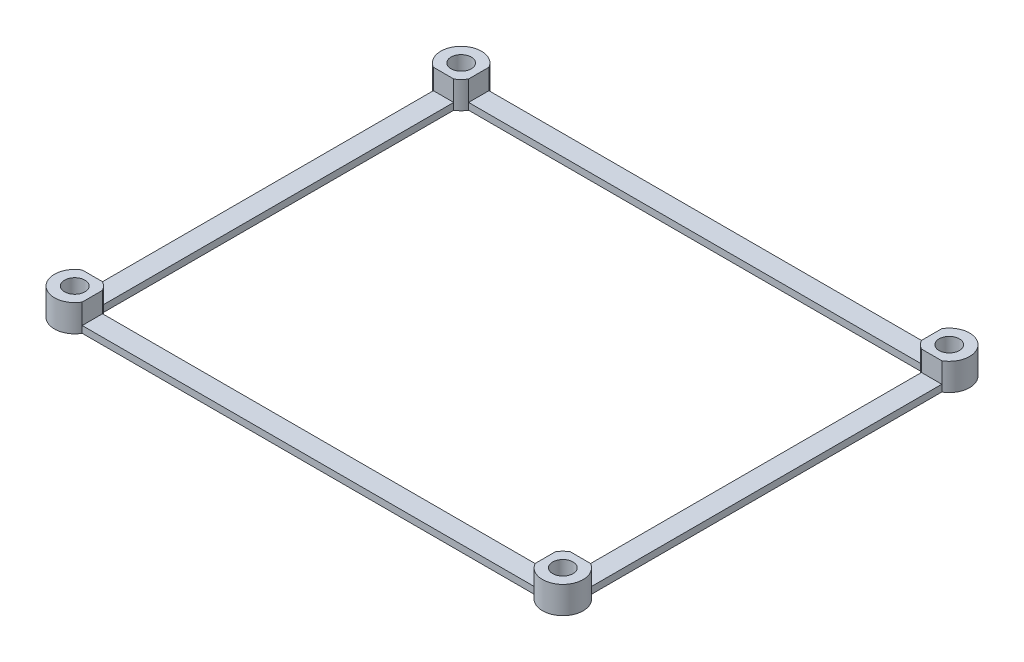
ISO-10303-21;
HEADER;
FILE_DESCRIPTION(('STEP AP214'),'2;1');
FILE_NAME('part.step','',(''),(''),'','','');
FILE_SCHEMA(('AUTOMOTIVE_DESIGN { 1 0 10303 214 1 1 1 1 }'));
ENDSEC;
DATA;
#1=APPLICATION_CONTEXT('core data for automotive mechanical design processes');
#2=APPLICATION_PROTOCOL_DEFINITION('international standard','automotive_design',2000,#1);
#3=PRODUCT_CONTEXT('',#1,'mechanical');
#4=PRODUCT('Part','Part','',(#3));
#5=PRODUCT_RELATED_PRODUCT_CATEGORY('part','',(#4));
#6=PRODUCT_DEFINITION_FORMATION('','',#4);
#7=PRODUCT_DEFINITION_CONTEXT('part definition',#1,'design');
#8=PRODUCT_DEFINITION('design','',#6,#7);
#9=PRODUCT_DEFINITION_SHAPE('','',#8);
#10=(LENGTH_UNIT() NAMED_UNIT(*) SI_UNIT(.MILLI.,.METRE.));
#11=(NAMED_UNIT(*) PLANE_ANGLE_UNIT() SI_UNIT($,.RADIAN.));
#12=(NAMED_UNIT(*) SI_UNIT($,.STERADIAN.) SOLID_ANGLE_UNIT());
#13=UNCERTAINTY_MEASURE_WITH_UNIT(LENGTH_MEASURE(1.E-05),#10,'distance_accuracy_value','');
#14=(GEOMETRIC_REPRESENTATION_CONTEXT(3) GLOBAL_UNCERTAINTY_ASSIGNED_CONTEXT((#13)) GLOBAL_UNIT_ASSIGNED_CONTEXT((#10,
#11,#12)) REPRESENTATION_CONTEXT('',''));
#15=CARTESIAN_POINT('',(0.,0.,0.));
#16=DIRECTION('',(0.,0.,1.));
#17=DIRECTION('',(1.,0.,0.));
#18=AXIS2_PLACEMENT_3D('',#15,#16,#17);
#19=CARTESIAN_POINT('',(36.,4.,-28.5));
#20=DIRECTION('',(0.,1.,0.));
#21=DIRECTION('',(0.,0.,1.));
#22=AXIS2_PLACEMENT_3D('',#19,#20,#21);
#23=PLANE('',#22);
#24=DIRECTION('',(-1.,0.,0.));
#25=VECTOR('',#24,1.);
#26=CARTESIAN_POINT('',(-37.5,4.,-25.9019237886467));
#27=LINE('',#26,#25);
#28=CARTESIAN_POINT('',(-34.5,4.,-25.9019237886467));
#29=VERTEX_POINT('',#28);
#30=CARTESIAN_POINT('',(-37.5,4.,-25.9019237886467));
#31=VERTEX_POINT('',#30);
#32=EDGE_CURVE('E226',#29,#31,#27,.T.);
#33=ORIENTED_EDGE('',*,*,#32,.F.);
#34=CARTESIAN_POINT('',(-36.,4.,-28.5));
#35=DIRECTION('',(0.,-1.,0.));
#36=DIRECTION('',(0.,0.,1.));
#37=AXIS2_PLACEMENT_3D('',#34,#35,#36);
#38=CIRCLE('',#37,3.);
#39=CARTESIAN_POINT('',(-33.4019237886467,4.,-27.));
#40=VERTEX_POINT('',#39);
#41=EDGE_CURVE('E325',#40,#29,#38,.T.);
#42=ORIENTED_EDGE('',*,*,#41,.F.);
#43=DIRECTION('',(0.,0.,1.));
#44=VECTOR('',#43,1.);
#45=CARTESIAN_POINT('',(-33.4019237886467,4.,-27.));
#46=LINE('',#45,#44);
#47=CARTESIAN_POINT('',(-33.4019237886467,4.,-30.));
#48=VERTEX_POINT('',#47);
#49=EDGE_CURVE('E324',#48,#40,#46,.T.);
#50=ORIENTED_EDGE('',*,*,#49,.F.);
#51=CARTESIAN_POINT('',(-36.,4.,-28.5));
#52=DIRECTION('',(0.,1.,0.));
#53=DIRECTION('',(0.,0.,1.));
#54=AXIS2_PLACEMENT_3D('',#51,#52,#53);
#55=CIRCLE('',#54,3.);
#56=EDGE_CURVE('E235',#48,#31,#55,.T.);
#57=ORIENTED_EDGE('',*,*,#56,.T.);
#58=EDGE_LOOP('',(#33,#42,#50,#57));
#59=FACE_BOUND('',#58,.T.);
#60=CARTESIAN_POINT('',(-36.,4.,-28.5));
#61=DIRECTION('',(0.,1.,0.));
#62=DIRECTION('',(0.,0.,1.));
#63=AXIS2_PLACEMENT_3D('',#60,#61,#62);
#64=CIRCLE('',#63,1.5);
#65=CARTESIAN_POINT('',(-36.,4.,-27.));
#66=VERTEX_POINT('',#65);
#67=EDGE_CURVE('E397',#66,#66,#64,.T.);
#68=ORIENTED_EDGE('',*,*,#67,.F.);
#69=EDGE_LOOP('',(#68));
#70=FACE_BOUND('',#69,.T.);
#71=ADVANCED_FACE('F41',(#59,#70),#23,.T.);
#72=DIRECTION('',(1.,0.,0.));
#73=VECTOR('',#72,1.);
#74=CARTESIAN_POINT('',(-37.5,4.,25.9019237886467));
#75=LINE('',#74,#73);
#76=CARTESIAN_POINT('',(-37.5,4.,25.9019237886467));
#77=VERTEX_POINT('',#76);
#78=CARTESIAN_POINT('',(-34.5,4.,25.9019237886467));
#79=VERTEX_POINT('',#78);
#80=EDGE_CURVE('E206',#77,#79,#75,.T.);
#81=ORIENTED_EDGE('',*,*,#80,.F.);
#82=CARTESIAN_POINT('',(-36.,4.,28.5));
#83=DIRECTION('',(0.,1.,0.));
#84=DIRECTION('',(0.,0.,1.));
#85=AXIS2_PLACEMENT_3D('',#82,#83,#84);
#86=CIRCLE('',#85,3.00000000000001);
#87=CARTESIAN_POINT('',(-33.4019237886467,4.,30.));
#88=VERTEX_POINT('',#87);
#89=EDGE_CURVE('E222',#77,#88,#86,.T.);
#90=ORIENTED_EDGE('',*,*,#89,.T.);
#91=DIRECTION('',(0.,0.,1.));
#92=VECTOR('',#91,1.);
#93=CARTESIAN_POINT('',(-33.4019237886467,4.,27.));
#94=LINE('',#93,#92);
#95=CARTESIAN_POINT('',(-33.4019237886467,4.,27.));
#96=VERTEX_POINT('',#95);
#97=EDGE_CURVE('E440',#96,#88,#94,.T.);
#98=ORIENTED_EDGE('',*,*,#97,.F.);
#99=CARTESIAN_POINT('',(-36.,4.,28.5));
#100=DIRECTION('',(0.,-1.,0.));
#101=DIRECTION('',(0.,0.,1.));
#102=AXIS2_PLACEMENT_3D('',#99,#100,#101);
#103=CIRCLE('',#102,3.00000000000001);
#104=EDGE_CURVE('E225',#79,#96,#103,.T.);
#105=ORIENTED_EDGE('',*,*,#104,.F.);
#106=EDGE_LOOP('',(#81,#90,#98,#105));
#107=FACE_BOUND('',#106,.T.);
#108=CARTESIAN_POINT('',(-36.,4.,28.5));
#109=DIRECTION('',(0.,1.,0.));
#110=DIRECTION('',(0.,0.,1.));
#111=AXIS2_PLACEMENT_3D('',#108,#109,#110);
#112=CIRCLE('',#111,1.5);
#113=CARTESIAN_POINT('',(-36.,4.,30.));
#114=VERTEX_POINT('',#113);
#115=EDGE_CURVE('E403',#114,#114,#112,.T.);
#116=ORIENTED_EDGE('',*,*,#115,.F.);
#117=EDGE_LOOP('',(#116));
#118=FACE_BOUND('',#117,.T.);
#119=ADVANCED_FACE('F219',(#107,#118),#23,.T.);
#120=DIRECTION('',(-1.,0.,0.));
#121=VECTOR('',#120,1.);
#122=CARTESIAN_POINT('',(34.5,4.,-25.9019237886467));
#123=LINE('',#122,#121);
#124=CARTESIAN_POINT('',(37.5,4.,-25.9019237886467));
#125=VERTEX_POINT('',#124);
#126=CARTESIAN_POINT('',(34.5,4.,-25.9019237886467));
#127=VERTEX_POINT('',#126);
#128=EDGE_CURVE('E427',#125,#127,#123,.T.);
#129=ORIENTED_EDGE('',*,*,#128,.F.);
#130=CARTESIAN_POINT('',(36.,4.,-28.5));
#131=DIRECTION('',(0.,1.,0.));
#132=DIRECTION('',(0.,0.,1.));
#133=AXIS2_PLACEMENT_3D('',#130,#131,#132);
#134=CIRCLE('',#133,3.);
#135=CARTESIAN_POINT('',(33.4019237886467,4.,-30.));
#136=VERTEX_POINT('',#135);
#137=EDGE_CURVE('E241',#125,#136,#134,.T.);
#138=ORIENTED_EDGE('',*,*,#137,.T.);
#139=DIRECTION('',(0.,0.,-1.));
#140=VECTOR('',#139,1.);
#141=CARTESIAN_POINT('',(33.4019237886467,4.,-27.));
#142=LINE('',#141,#140);
#143=CARTESIAN_POINT('',(33.4019237886467,4.,-27.));
#144=VERTEX_POINT('',#143);
#145=EDGE_CURVE('E327',#144,#136,#142,.T.);
#146=ORIENTED_EDGE('',*,*,#145,.F.);
#147=CARTESIAN_POINT('',(36.,4.,-28.5));
#148=DIRECTION('',(0.,-1.,0.));
#149=DIRECTION('',(0.,0.,1.));
#150=AXIS2_PLACEMENT_3D('',#147,#148,#149);
#151=CIRCLE('',#150,3.);
#152=EDGE_CURVE('E344',#127,#144,#151,.T.);
#153=ORIENTED_EDGE('',*,*,#152,.F.);
#154=EDGE_LOOP('',(#129,#138,#146,#153));
#155=FACE_BOUND('',#154,.T.);
#156=CARTESIAN_POINT('',(36.,4.,-28.5));
#157=DIRECTION('',(0.,1.,0.));
#158=DIRECTION('',(0.,0.,1.));
#159=AXIS2_PLACEMENT_3D('',#156,#157,#158);
#160=CIRCLE('',#159,1.5);
#161=CARTESIAN_POINT('',(36.,4.,-27.));
#162=VERTEX_POINT('',#161);
#163=EDGE_CURVE('E249',#162,#162,#160,.T.);
#164=ORIENTED_EDGE('',*,*,#163,.F.);
#165=EDGE_LOOP('',(#164));
#166=FACE_BOUND('',#165,.T.);
#167=ADVANCED_FACE('F424',(#155,#166),#23,.T.);
#168=CARTESIAN_POINT('',(-33.4019237886467,4.,-30.));
#169=DIRECTION('',(0.,0.,1.));
#170=DIRECTION('',(1.,0.,0.));
#171=AXIS2_PLACEMENT_3D('',#168,#169,#170);
#172=PLANE('',#171);
#173=DIRECTION('',(1.,0.,0.));
#174=VECTOR('',#173,1.);
#175=CARTESIAN_POINT('',(33.4019237886467,1.,-30.));
#176=LINE('',#175,#174);
#177=CARTESIAN_POINT('',(-33.4019237886467,1.,-30.));
#178=VERTEX_POINT('',#177);
#179=CARTESIAN_POINT('',(33.4019237886467,1.,-30.));
#180=VERTEX_POINT('',#179);
#181=EDGE_CURVE('E334',#178,#180,#176,.T.);
#182=ORIENTED_EDGE('',*,*,#181,.T.);
#183=DIRECTION('',(0.,-1.,0.));
#184=VECTOR('',#183,1.);
#185=CARTESIAN_POINT('',(33.4019237886467,4.,-30.));
#186=LINE('',#185,#184);
#187=CARTESIAN_POINT('',(33.4019237886467,0.,-30.));
#188=VERTEX_POINT('',#187);
#189=EDGE_CURVE('E49',#180,#188,#186,.T.);
#190=ORIENTED_EDGE('',*,*,#189,.T.);
#191=DIRECTION('',(-1.,0.,0.));
#192=VECTOR('',#191,1.);
#193=CARTESIAN_POINT('',(-33.4019237886467,0.,-30.));
#194=LINE('',#193,#192);
#195=CARTESIAN_POINT('',(-33.4019237886467,0.,-30.));
#196=VERTEX_POINT('',#195);
#197=EDGE_CURVE('E248',#188,#196,#194,.T.);
#198=ORIENTED_EDGE('',*,*,#197,.T.);
#199=DIRECTION('',(0.,-1.,0.));
#200=VECTOR('',#199,1.);
#201=CARTESIAN_POINT('',(-33.4019237886467,4.,-30.));
#202=LINE('',#201,#200);
#203=EDGE_CURVE('E283',#178,#196,#202,.T.);
#204=ORIENTED_EDGE('',*,*,#203,.F.);
#205=EDGE_LOOP('',(#182,#190,#198,#204));
#206=FACE_BOUND('',#205,.T.);
#207=ADVANCED_FACE('F296',(#206),#172,.F.);
#208=CARTESIAN_POINT('',(-37.5,4.,25.9019237886467));
#209=DIRECTION('',(1.,0.,0.));
#210=DIRECTION('',(0.,0.,-1.));
#211=AXIS2_PLACEMENT_3D('',#208,#209,#210);
#212=PLANE('',#211);
#213=DIRECTION('',(0.,0.,-1.));
#214=VECTOR('',#213,1.);
#215=CARTESIAN_POINT('',(-37.5,1.,-25.9019237886467));
#216=LINE('',#215,#214);
#217=CARTESIAN_POINT('',(-37.5,1.,25.9019237886467));
#218=VERTEX_POINT('',#217);
#219=CARTESIAN_POINT('',(-37.5,1.,-25.9019237886467));
#220=VERTEX_POINT('',#219);
#221=EDGE_CURVE('E308',#218,#220,#216,.T.);
#222=ORIENTED_EDGE('',*,*,#221,.T.);
#223=DIRECTION('',(0.,-1.,0.));
#224=VECTOR('',#223,1.);
#225=CARTESIAN_POINT('',(-37.5,4.,-25.9019237886467));
#226=LINE('',#225,#224);
#227=CARTESIAN_POINT('',(-37.5,0.,-25.9019237886467));
#228=VERTEX_POINT('',#227);
#229=EDGE_CURVE('E213',#220,#228,#226,.T.);
#230=ORIENTED_EDGE('',*,*,#229,.T.);
#231=DIRECTION('',(0.,0.,1.));
#232=VECTOR('',#231,1.);
#233=CARTESIAN_POINT('',(-37.5,0.,25.9019237886467));
#234=LINE('',#233,#232);
#235=CARTESIAN_POINT('',(-37.5,0.,25.9019237886467));
#236=VERTEX_POINT('',#235);
#237=EDGE_CURVE('E255',#228,#236,#234,.T.);
#238=ORIENTED_EDGE('',*,*,#237,.T.);
#239=DIRECTION('',(0.,-1.,0.));
#240=VECTOR('',#239,1.);
#241=CARTESIAN_POINT('',(-37.5,4.,25.9019237886467));
#242=LINE('',#241,#240);
#243=EDGE_CURVE('E214',#218,#236,#242,.T.);
#244=ORIENTED_EDGE('',*,*,#243,.F.);
#245=EDGE_LOOP('',(#222,#230,#238,#244));
#246=FACE_BOUND('',#245,.T.);
#247=ADVANCED_FACE('F307',(#246),#212,.F.);
#248=CARTESIAN_POINT('',(-33.4019237886467,4.,30.));
#249=DIRECTION('',(0.,0.,-1.));
#250=DIRECTION('',(-1.,0.,0.));
#251=AXIS2_PLACEMENT_3D('',#248,#249,#250);
#252=PLANE('',#251);
#253=DIRECTION('',(-1.,0.,0.));
#254=VECTOR('',#253,1.);
#255=CARTESIAN_POINT('',(-33.4019237886467,1.,30.));
#256=LINE('',#255,#254);
#257=CARTESIAN_POINT('',(33.4019237886467,1.,30.));
#258=VERTEX_POINT('',#257);
#259=CARTESIAN_POINT('',(-33.4019237886467,1.,30.));
#260=VERTEX_POINT('',#259);
#261=EDGE_CURVE('E227',#258,#260,#256,.T.);
#262=ORIENTED_EDGE('',*,*,#261,.T.);
#263=DIRECTION('',(0.,-1.,0.));
#264=VECTOR('',#263,1.);
#265=CARTESIAN_POINT('',(-33.4019237886467,4.,30.));
#266=LINE('',#265,#264);
#267=CARTESIAN_POINT('',(-33.4019237886467,0.,30.));
#268=VERTEX_POINT('',#267);
#269=EDGE_CURVE('E279',#260,#268,#266,.T.);
#270=ORIENTED_EDGE('',*,*,#269,.T.);
#271=DIRECTION('',(1.,0.,0.));
#272=VECTOR('',#271,1.);
#273=CARTESIAN_POINT('',(-33.4019237886467,0.,30.));
#274=LINE('',#273,#272);
#275=CARTESIAN_POINT('',(33.4019237886467,0.,30.));
#276=VERTEX_POINT('',#275);
#277=EDGE_CURVE('E260',#268,#276,#274,.T.);
#278=ORIENTED_EDGE('',*,*,#277,.T.);
#279=DIRECTION('',(0.,-1.,0.));
#280=VECTOR('',#279,1.);
#281=CARTESIAN_POINT('',(33.4019237886467,4.,30.));
#282=LINE('',#281,#280);
#283=EDGE_CURVE('E275',#258,#276,#282,.T.);
#284=ORIENTED_EDGE('',*,*,#283,.F.);
#285=EDGE_LOOP('',(#262,#270,#278,#284));
#286=FACE_BOUND('',#285,.T.);
#287=ADVANCED_FACE('F522',(#286),#252,.F.);
#288=CARTESIAN_POINT('',(37.5,4.,25.9019237886467));
#289=DIRECTION('',(-1.,0.,0.));
#290=DIRECTION('',(0.,0.,1.));
#291=AXIS2_PLACEMENT_3D('',#288,#289,#290);
#292=PLANE('',#291);
#293=DIRECTION('',(0.,0.,1.));
#294=VECTOR('',#293,1.);
#295=CARTESIAN_POINT('',(37.5,1.,25.9019237886467));
#296=LINE('',#295,#294);
#297=CARTESIAN_POINT('',(37.5,1.,-25.9019237886467));
#298=VERTEX_POINT('',#297);
#299=CARTESIAN_POINT('',(37.5,1.,25.9019237886467));
#300=VERTEX_POINT('',#299);
#301=EDGE_CURVE('E443',#298,#300,#296,.T.);
#302=ORIENTED_EDGE('',*,*,#301,.T.);
#303=DIRECTION('',(0.,-1.,0.));
#304=VECTOR('',#303,1.);
#305=CARTESIAN_POINT('',(37.5,4.,25.9019237886467));
#306=LINE('',#305,#304);
#307=CARTESIAN_POINT('',(37.5,0.,25.9019237886467));
#308=VERTEX_POINT('',#307);
#309=EDGE_CURVE('E272',#300,#308,#306,.T.);
#310=ORIENTED_EDGE('',*,*,#309,.T.);
#311=DIRECTION('',(0.,0.,-1.));
#312=VECTOR('',#311,1.);
#313=CARTESIAN_POINT('',(37.5,0.,25.9019237886467));
#314=LINE('',#313,#312);
#315=CARTESIAN_POINT('',(37.5,0.,-25.9019237886467));
#316=VERTEX_POINT('',#315);
#317=EDGE_CURVE('E266',#308,#316,#314,.T.);
#318=ORIENTED_EDGE('',*,*,#317,.T.);
#319=DIRECTION('',(0.,-1.,0.));
#320=VECTOR('',#319,1.);
#321=CARTESIAN_POINT('',(37.5,4.,-25.9019237886467));
#322=LINE('',#321,#320);
#323=EDGE_CURVE('E238',#298,#316,#322,.T.);
#324=ORIENTED_EDGE('',*,*,#323,.F.);
#325=EDGE_LOOP('',(#302,#310,#318,#324));
#326=FACE_BOUND('',#325,.T.);
#327=ADVANCED_FACE('F532',(#326),#292,.F.);
#328=CARTESIAN_POINT('',(-34.5,4.,25.9019237886467));
#329=DIRECTION('',(1.,0.,0.));
#330=DIRECTION('',(0.,0.,-1.));
#331=AXIS2_PLACEMENT_3D('',#328,#329,#330);
#332=PLANE('',#331);
#333=DIRECTION('',(0.,-1.,0.));
#334=VECTOR('',#333,1.);
#335=CARTESIAN_POINT('',(-34.5,4.,-25.9019237886467));
#336=LINE('',#335,#334);
#337=CARTESIAN_POINT('',(-34.5,1.,-25.9019237886467));
#338=VERTEX_POINT('',#337);
#339=CARTESIAN_POINT('',(-34.5,0.,-25.9019237886467));
#340=VERTEX_POINT('',#339);
#341=EDGE_CURVE('E394',#338,#340,#336,.T.);
#342=ORIENTED_EDGE('',*,*,#341,.F.);
#343=DIRECTION('',(0.,0.,1.));
#344=VECTOR('',#343,1.);
#345=CARTESIAN_POINT('',(-34.5,1.,-25.9019237886467));
#346=LINE('',#345,#344);
#347=CARTESIAN_POINT('',(-34.5,1.,25.9019237886467));
#348=VERTEX_POINT('',#347);
#349=EDGE_CURVE('E320',#338,#348,#346,.T.);
#350=ORIENTED_EDGE('',*,*,#349,.T.);
#351=DIRECTION('',(0.,-1.,0.));
#352=VECTOR('',#351,1.);
#353=CARTESIAN_POINT('',(-34.5,4.,25.9019237886467));
#354=LINE('',#353,#352);
#355=CARTESIAN_POINT('',(-34.5,0.,25.9019237886467));
#356=VERTEX_POINT('',#355);
#357=EDGE_CURVE('E391',#348,#356,#354,.T.);
#358=ORIENTED_EDGE('',*,*,#357,.T.);
#359=DIRECTION('',(0.,0.,1.));
#360=VECTOR('',#359,1.);
#361=CARTESIAN_POINT('',(-34.5,0.,25.9019237886467));
#362=LINE('',#361,#360);
#363=EDGE_CURVE('E350',#340,#356,#362,.T.);
#364=ORIENTED_EDGE('',*,*,#363,.F.);
#365=EDGE_LOOP('',(#342,#350,#358,#364));
#366=FACE_BOUND('',#365,.T.);
#367=ADVANCED_FACE('F470',(#366),#332,.T.);
#368=CARTESIAN_POINT('',(-33.4019237886467,4.,27.));
#369=DIRECTION('',(0.,0.,-1.));
#370=DIRECTION('',(-1.,0.,0.));
#371=AXIS2_PLACEMENT_3D('',#368,#369,#370);
#372=PLANE('',#371);
#373=DIRECTION('',(0.,-1.,0.));
#374=VECTOR('',#373,1.);
#375=CARTESIAN_POINT('',(-33.4019237886467,4.,27.));
#376=LINE('',#375,#374);
#377=CARTESIAN_POINT('',(-33.4019237886467,1.,27.));
#378=VERTEX_POINT('',#377);
#379=CARTESIAN_POINT('',(-33.4019237886467,0.,27.));
#380=VERTEX_POINT('',#379);
#381=EDGE_CURVE('E387',#378,#380,#376,.T.);
#382=ORIENTED_EDGE('',*,*,#381,.F.);
#383=DIRECTION('',(1.,0.,0.));
#384=VECTOR('',#383,1.);
#385=CARTESIAN_POINT('',(-33.4019237886467,1.,27.));
#386=LINE('',#385,#384);
#387=CARTESIAN_POINT('',(33.4019237886467,1.,27.));
#388=VERTEX_POINT('',#387);
#389=EDGE_CURVE('E459',#378,#388,#386,.T.);
#390=ORIENTED_EDGE('',*,*,#389,.T.);
#391=DIRECTION('',(0.,-1.,0.));
#392=VECTOR('',#391,1.);
#393=CARTESIAN_POINT('',(33.4019237886467,4.,27.));
#394=LINE('',#393,#392);
#395=CARTESIAN_POINT('',(33.4019237886467,0.,27.));
#396=VERTEX_POINT('',#395);
#397=EDGE_CURVE('E383',#388,#396,#394,.T.);
#398=ORIENTED_EDGE('',*,*,#397,.T.);
#399=DIRECTION('',(1.,0.,0.));
#400=VECTOR('',#399,1.);
#401=CARTESIAN_POINT('',(-33.4019237886467,0.,27.));
#402=LINE('',#401,#400);
#403=EDGE_CURVE('E356',#380,#396,#402,.T.);
#404=ORIENTED_EDGE('',*,*,#403,.F.);
#405=EDGE_LOOP('',(#382,#390,#398,#404));
#406=FACE_BOUND('',#405,.T.);
#407=ADVANCED_FACE('F542',(#406),#372,.T.);
#408=CARTESIAN_POINT('',(34.5,4.,25.9019237886467));
#409=DIRECTION('',(-1.,0.,0.));
#410=DIRECTION('',(0.,0.,1.));
#411=AXIS2_PLACEMENT_3D('',#408,#409,#410);
#412=PLANE('',#411);
#413=DIRECTION('',(0.,-1.,0.));
#414=VECTOR('',#413,1.);
#415=CARTESIAN_POINT('',(34.5,4.,25.9019237886467));
#416=LINE('',#415,#414);
#417=CARTESIAN_POINT('',(34.5,1.,25.9019237886467));
#418=VERTEX_POINT('',#417);
#419=CARTESIAN_POINT('',(34.5,0.,25.9019237886467));
#420=VERTEX_POINT('',#419);
#421=EDGE_CURVE('E379',#418,#420,#416,.T.);
#422=ORIENTED_EDGE('',*,*,#421,.F.);
#423=DIRECTION('',(0.,0.,-1.));
#424=VECTOR('',#423,1.);
#425=CARTESIAN_POINT('',(34.5,1.,25.9019237886467));
#426=LINE('',#425,#424);
#427=CARTESIAN_POINT('',(34.5,1.,-25.9019237886467));
#428=VERTEX_POINT('',#427);
#429=EDGE_CURVE('E441',#418,#428,#426,.T.);
#430=ORIENTED_EDGE('',*,*,#429,.T.);
#431=DIRECTION('',(0.,-1.,0.));
#432=VECTOR('',#431,1.);
#433=CARTESIAN_POINT('',(34.5,4.,-25.9019237886467));
#434=LINE('',#433,#432);
#435=CARTESIAN_POINT('',(34.5,0.,-25.9019237886467));
#436=VERTEX_POINT('',#435);
#437=EDGE_CURVE('E375',#428,#436,#434,.T.);
#438=ORIENTED_EDGE('',*,*,#437,.T.);
#439=DIRECTION('',(0.,0.,-1.));
#440=VECTOR('',#439,1.);
#441=CARTESIAN_POINT('',(34.5,0.,25.9019237886467));
#442=LINE('',#441,#440);
#443=EDGE_CURVE('E362',#420,#436,#442,.T.);
#444=ORIENTED_EDGE('',*,*,#443,.F.);
#445=EDGE_LOOP('',(#422,#430,#438,#444));
#446=FACE_BOUND('',#445,.T.);
#447=ADVANCED_FACE('F511',(#446),#412,.T.);
#448=CARTESIAN_POINT('',(-33.4019237886467,4.,-27.));
#449=DIRECTION('',(0.,0.,1.));
#450=DIRECTION('',(1.,0.,0.));
#451=AXIS2_PLACEMENT_3D('',#448,#449,#450);
#452=PLANE('',#451);
#453=DIRECTION('',(0.,-1.,0.));
#454=VECTOR('',#453,1.);
#455=CARTESIAN_POINT('',(33.4019237886467,4.,-27.));
#456=LINE('',#455,#454);
#457=CARTESIAN_POINT('',(33.4019237886467,1.,-27.));
#458=VERTEX_POINT('',#457);
#459=CARTESIAN_POINT('',(33.4019237886467,0.,-27.));
#460=VERTEX_POINT('',#459);
#461=EDGE_CURVE('E371',#458,#460,#456,.T.);
#462=ORIENTED_EDGE('',*,*,#461,.F.);
#463=DIRECTION('',(-1.,0.,0.));
#464=VECTOR('',#463,1.);
#465=CARTESIAN_POINT('',(33.4019237886467,1.,-27.));
#466=LINE('',#465,#464);
#467=CARTESIAN_POINT('',(-33.4019237886467,1.,-27.));
#468=VERTEX_POINT('',#467);
#469=EDGE_CURVE('E329',#458,#468,#466,.T.);
#470=ORIENTED_EDGE('',*,*,#469,.T.);
#471=DIRECTION('',(0.,-1.,0.));
#472=VECTOR('',#471,1.);
#473=CARTESIAN_POINT('',(-33.4019237886467,4.,-27.));
#474=LINE('',#473,#472);
#475=CARTESIAN_POINT('',(-33.4019237886467,0.,-27.));
#476=VERTEX_POINT('',#475);
#477=EDGE_CURVE('E64',#468,#476,#474,.T.);
#478=ORIENTED_EDGE('',*,*,#477,.T.);
#479=DIRECTION('',(-1.,0.,0.));
#480=VECTOR('',#479,1.);
#481=CARTESIAN_POINT('',(-33.4019237886467,0.,-27.));
#482=LINE('',#481,#480);
#483=EDGE_CURVE('E339',#460,#476,#482,.T.);
#484=ORIENTED_EDGE('',*,*,#483,.F.);
#485=EDGE_LOOP('',(#462,#470,#478,#484));
#486=FACE_BOUND('',#485,.T.);
#487=ADVANCED_FACE('F503',(#486),#452,.T.);
#488=DIRECTION('',(0.,0.,-1.));
#489=VECTOR('',#488,1.);
#490=CARTESIAN_POINT('',(33.4019237886467,4.,27.));
#491=LINE('',#490,#489);
#492=CARTESIAN_POINT('',(33.4019237886467,4.,30.));
#493=VERTEX_POINT('',#492);
#494=CARTESIAN_POINT('',(33.4019237886467,4.,27.));
#495=VERTEX_POINT('',#494);
#496=EDGE_CURVE('E454',#493,#495,#491,.T.);
#497=ORIENTED_EDGE('',*,*,#496,.F.);
#498=CARTESIAN_POINT('',(36.,4.,28.5));
#499=DIRECTION('',(0.,1.,0.));
#500=DIRECTION('',(0.,0.,1.));
#501=AXIS2_PLACEMENT_3D('',#498,#499,#500);
#502=CIRCLE('',#501,3.);
#503=CARTESIAN_POINT('',(37.5,4.,25.9019237886467));
#504=VERTEX_POINT('',#503);
#505=EDGE_CURVE('E234',#493,#504,#502,.T.);
#506=ORIENTED_EDGE('',*,*,#505,.T.);
#507=DIRECTION('',(1.,0.,0.));
#508=VECTOR('',#507,1.);
#509=CARTESIAN_POINT('',(34.5,4.,25.9019237886467));
#510=LINE('',#509,#508);
#511=CARTESIAN_POINT('',(34.5,4.,25.9019237886467));
#512=VERTEX_POINT('',#511);
#513=EDGE_CURVE('E336',#512,#504,#510,.T.);
#514=ORIENTED_EDGE('',*,*,#513,.F.);
#515=CARTESIAN_POINT('',(36.,4.,28.5));
#516=DIRECTION('',(0.,-1.,0.));
#517=DIRECTION('',(0.,0.,1.));
#518=AXIS2_PLACEMENT_3D('',#515,#516,#517);
#519=CIRCLE('',#518,3.);
#520=EDGE_CURVE('E341',#495,#512,#519,.T.);
#521=ORIENTED_EDGE('',*,*,#520,.F.);
#522=EDGE_LOOP('',(#497,#506,#514,#521));
#523=FACE_BOUND('',#522,.T.);
#524=CARTESIAN_POINT('',(36.,4.,28.5));
#525=DIRECTION('',(0.,1.,0.));
#526=DIRECTION('',(0.,0.,1.));
#527=AXIS2_PLACEMENT_3D('',#524,#525,#526);
#528=CIRCLE('',#527,1.5);
#529=CARTESIAN_POINT('',(36.,4.,30.));
#530=VERTEX_POINT('',#529);
#531=EDGE_CURVE('E409',#530,#530,#528,.T.);
#532=ORIENTED_EDGE('',*,*,#531,.F.);
#533=EDGE_LOOP('',(#532));
#534=FACE_BOUND('',#533,.T.);
#535=ADVANCED_FACE('F496',(#523,#534),#23,.T.);
#536=CARTESIAN_POINT('',(36.,0.,-28.5));
#537=DIRECTION('',(0.,1.,0.));
#538=DIRECTION('',(0.,0.,1.));
#539=AXIS2_PLACEMENT_3D('',#536,#537,#538);
#540=PLANE('',#539);
#541=CARTESIAN_POINT('',(-36.,0.,-28.5));
#542=DIRECTION('',(0.,1.,0.));
#543=DIRECTION('',(0.,0.,1.));
#544=AXIS2_PLACEMENT_3D('',#541,#542,#543);
#545=CIRCLE('',#544,1.5);
#546=CARTESIAN_POINT('',(-36.,0.,-27.));
#547=VERTEX_POINT('',#546);
#548=EDGE_CURVE('E396',#547,#547,#545,.T.);
#549=ORIENTED_EDGE('',*,*,#548,.T.);
#550=EDGE_LOOP('',(#549));
#551=FACE_BOUND('',#550,.T.);
#552=CARTESIAN_POINT('',(-36.,0.,28.5));
#553=DIRECTION('',(0.,1.,0.));
#554=DIRECTION('',(0.,0.,1.));
#555=AXIS2_PLACEMENT_3D('',#552,#553,#554);
#556=CIRCLE('',#555,1.5);
#557=CARTESIAN_POINT('',(-36.,0.,30.));
#558=VERTEX_POINT('',#557);
#559=EDGE_CURVE('E400',#558,#558,#556,.T.);
#560=ORIENTED_EDGE('',*,*,#559,.T.);
#561=EDGE_LOOP('',(#560));
#562=FACE_BOUND('',#561,.T.);
#563=CARTESIAN_POINT('',(36.,0.,28.5));
#564=DIRECTION('',(0.,1.,0.));
#565=DIRECTION('',(0.,0.,1.));
#566=AXIS2_PLACEMENT_3D('',#563,#564,#565);
#567=CIRCLE('',#566,1.5);
#568=CARTESIAN_POINT('',(36.,0.,30.));
#569=VERTEX_POINT('',#568);
#570=EDGE_CURVE('E406',#569,#569,#567,.T.);
#571=ORIENTED_EDGE('',*,*,#570,.T.);
#572=EDGE_LOOP('',(#571));
#573=FACE_BOUND('',#572,.T.);
#574=CARTESIAN_POINT('',(36.,0.,-28.5));
#575=DIRECTION('',(0.,1.,0.));
#576=DIRECTION('',(0.,0.,1.));
#577=AXIS2_PLACEMENT_3D('',#574,#575,#576);
#578=CIRCLE('',#577,1.5);
#579=CARTESIAN_POINT('',(36.,0.,-27.));
#580=VERTEX_POINT('',#579);
#581=EDGE_CURVE('E412',#580,#580,#578,.T.);
#582=ORIENTED_EDGE('',*,*,#581,.T.);
#583=EDGE_LOOP('',(#582));
#584=FACE_BOUND('',#583,.T.);
#585=CARTESIAN_POINT('',(36.,0.,-28.5));
#586=DIRECTION('',(0.,1.,0.));
#587=DIRECTION('',(0.,0.,1.));
#588=AXIS2_PLACEMENT_3D('',#585,#586,#587);
#589=CIRCLE('',#588,3.);
#590=EDGE_CURVE('E245',#316,#188,#589,.T.);
#591=ORIENTED_EDGE('',*,*,#590,.F.);
#592=ORIENTED_EDGE('',*,*,#317,.F.);
#593=CARTESIAN_POINT('',(36.,0.,28.5));
#594=DIRECTION('',(0.,1.,0.));
#595=DIRECTION('',(0.,0.,1.));
#596=AXIS2_PLACEMENT_3D('',#593,#594,#595);
#597=CIRCLE('',#596,3.);
#598=EDGE_CURVE('E263',#276,#308,#597,.T.);
#599=ORIENTED_EDGE('',*,*,#598,.F.);
#600=ORIENTED_EDGE('',*,*,#277,.F.);
#601=CARTESIAN_POINT('',(-36.,0.,28.5));
#602=DIRECTION('',(0.,1.,0.));
#603=DIRECTION('',(0.,0.,1.));
#604=AXIS2_PLACEMENT_3D('',#601,#602,#603);
#605=CIRCLE('',#604,3.00000000000001);
#606=EDGE_CURVE('E258',#236,#268,#605,.T.);
#607=ORIENTED_EDGE('',*,*,#606,.F.);
#608=ORIENTED_EDGE('',*,*,#237,.F.);
#609=CARTESIAN_POINT('',(-36.,0.,-28.5));
#610=DIRECTION('',(0.,1.,0.));
#611=DIRECTION('',(0.,0.,1.));
#612=AXIS2_PLACEMENT_3D('',#609,#610,#611);
#613=CIRCLE('',#612,3.);
#614=EDGE_CURVE('E252',#196,#228,#613,.T.);
#615=ORIENTED_EDGE('',*,*,#614,.F.);
#616=ORIENTED_EDGE('',*,*,#197,.F.);
#617=EDGE_LOOP('',(#591,#592,#599,#600,#607,#608,#615,#616));
#618=FACE_BOUND('',#617,.T.);
#619=CARTESIAN_POINT('',(-36.,0.,-28.5));
#620=DIRECTION('',(0.,-1.,0.));
#621=DIRECTION('',(0.,0.,1.));
#622=AXIS2_PLACEMENT_3D('',#619,#620,#621);
#623=CIRCLE('',#622,3.);
#624=EDGE_CURVE('E347',#476,#340,#623,.T.);
#625=ORIENTED_EDGE('',*,*,#624,.T.);
#626=ORIENTED_EDGE('',*,*,#363,.T.);
#627=CARTESIAN_POINT('',(-36.,0.,28.5));
#628=DIRECTION('',(0.,-1.,0.));
#629=DIRECTION('',(0.,0.,1.));
#630=AXIS2_PLACEMENT_3D('',#627,#628,#629);
#631=CIRCLE('',#630,3.00000000000001);
#632=EDGE_CURVE('E353',#356,#380,#631,.T.);
#633=ORIENTED_EDGE('',*,*,#632,.T.);
#634=ORIENTED_EDGE('',*,*,#403,.T.);
#635=CARTESIAN_POINT('',(36.,0.,28.5));
#636=DIRECTION('',(0.,-1.,0.));
#637=DIRECTION('',(0.,0.,1.));
#638=AXIS2_PLACEMENT_3D('',#635,#636,#637);
#639=CIRCLE('',#638,3.);
#640=EDGE_CURVE('E359',#396,#420,#639,.T.);
#641=ORIENTED_EDGE('',*,*,#640,.T.);
#642=ORIENTED_EDGE('',*,*,#443,.T.);
#643=CARTESIAN_POINT('',(36.,0.,-28.5));
#644=DIRECTION('',(0.,-1.,0.));
#645=DIRECTION('',(0.,0.,1.));
#646=AXIS2_PLACEMENT_3D('',#643,#644,#645);
#647=CIRCLE('',#646,3.);
#648=EDGE_CURVE('E365',#436,#460,#647,.T.);
#649=ORIENTED_EDGE('',*,*,#648,.T.);
#650=ORIENTED_EDGE('',*,*,#483,.T.);
#651=EDGE_LOOP('',(#625,#626,#633,#634,#641,#642,#649,#650));
#652=FACE_BOUND('',#651,.T.);
#653=ADVANCED_FACE('F300',(#551,#562,#573,#584,#618,#652),#540,.F.);
#654=CARTESIAN_POINT('',(36.,4.,-28.5));
#655=DIRECTION('',(0.,-1.,0.));
#656=DIRECTION('',(0.,0.,-1.));
#657=AXIS2_PLACEMENT_3D('',#654,#655,#656);
#658=CYLINDRICAL_SURFACE('',#657,3.);
#659=ORIENTED_EDGE('',*,*,#590,.T.);
#660=ORIENTED_EDGE('',*,*,#189,.F.);
#661=EDGE_CURVE('E12',#136,#180,#186,.T.);
#662=ORIENTED_EDGE('',*,*,#661,.F.);
#663=ORIENTED_EDGE('',*,*,#137,.F.);
#664=EDGE_CURVE('E269',#125,#298,#322,.T.);
#665=ORIENTED_EDGE('',*,*,#664,.T.);
#666=ORIENTED_EDGE('',*,*,#323,.T.);
#667=EDGE_LOOP('',(#659,#660,#662,#663,#665,#666));
#668=FACE_BOUND('',#667,.T.);
#669=ADVANCED_FACE('F43',(#668),#658,.T.);
#670=CARTESIAN_POINT('',(-36.,4.,-28.5));
#671=DIRECTION('',(0.,-1.,0.));
#672=DIRECTION('',(0.,0.,-1.));
#673=AXIS2_PLACEMENT_3D('',#670,#671,#672);
#674=CYLINDRICAL_SURFACE('',#673,3.);
#675=ORIENTED_EDGE('',*,*,#614,.T.);
#676=ORIENTED_EDGE('',*,*,#229,.F.);
#677=EDGE_CURVE('E281',#31,#220,#226,.T.);
#678=ORIENTED_EDGE('',*,*,#677,.F.);
#679=ORIENTED_EDGE('',*,*,#56,.F.);
#680=EDGE_CURVE('E284',#48,#178,#202,.T.);
#681=ORIENTED_EDGE('',*,*,#680,.T.);
#682=ORIENTED_EDGE('',*,*,#203,.T.);
#683=EDGE_LOOP('',(#675,#676,#678,#679,#681,#682));
#684=FACE_BOUND('',#683,.T.);
#685=ADVANCED_FACE('F289',(#684),#674,.T.);
#686=CARTESIAN_POINT('',(-36.,4.,28.5));
#687=DIRECTION('',(0.,-1.,0.));
#688=DIRECTION('',(0.,0.,-1.));
#689=AXIS2_PLACEMENT_3D('',#686,#687,#688);
#690=CYLINDRICAL_SURFACE('',#689,3.00000000000001);
#691=ORIENTED_EDGE('',*,*,#606,.T.);
#692=ORIENTED_EDGE('',*,*,#269,.F.);
#693=EDGE_CURVE('E233',#88,#260,#266,.T.);
#694=ORIENTED_EDGE('',*,*,#693,.F.);
#695=ORIENTED_EDGE('',*,*,#89,.F.);
#696=EDGE_CURVE('E203',#77,#218,#242,.T.);
#697=ORIENTED_EDGE('',*,*,#696,.T.);
#698=ORIENTED_EDGE('',*,*,#243,.T.);
#699=EDGE_LOOP('',(#691,#692,#694,#695,#697,#698));
#700=FACE_BOUND('',#699,.T.);
#701=ADVANCED_FACE('F230',(#700),#690,.T.);
#702=CARTESIAN_POINT('',(36.,4.,28.5));
#703=DIRECTION('',(0.,-1.,0.));
#704=DIRECTION('',(0.,0.,-1.));
#705=AXIS2_PLACEMENT_3D('',#702,#703,#704);
#706=CYLINDRICAL_SURFACE('',#705,3.);
#707=ORIENTED_EDGE('',*,*,#598,.T.);
#708=ORIENTED_EDGE('',*,*,#309,.F.);
#709=EDGE_CURVE('E273',#504,#300,#306,.T.);
#710=ORIENTED_EDGE('',*,*,#709,.F.);
#711=ORIENTED_EDGE('',*,*,#505,.F.);
#712=EDGE_CURVE('E276',#493,#258,#282,.T.);
#713=ORIENTED_EDGE('',*,*,#712,.T.);
#714=ORIENTED_EDGE('',*,*,#283,.T.);
#715=EDGE_LOOP('',(#707,#708,#710,#711,#713,#714));
#716=FACE_BOUND('',#715,.T.);
#717=ADVANCED_FACE('F529',(#716),#706,.T.);
#718=CARTESIAN_POINT('',(36.,4.,-28.5));
#719=DIRECTION('',(0.,-1.,0.));
#720=DIRECTION('',(0.,0.,-1.));
#721=AXIS2_PLACEMENT_3D('',#718,#719,#720);
#722=CYLINDRICAL_SURFACE('',#721,1.5);
#723=ORIENTED_EDGE('',*,*,#163,.T.);
#724=EDGE_LOOP('',(#723));
#725=FACE_BOUND('',#724,.T.);
#726=ORIENTED_EDGE('',*,*,#581,.F.);
#727=EDGE_LOOP('',(#726));
#728=FACE_BOUND('',#727,.T.);
#729=ADVANCED_FACE('F535',(#725,#728),#722,.F.);
#730=CARTESIAN_POINT('',(36.,4.,28.5));
#731=DIRECTION('',(0.,-1.,0.));
#732=DIRECTION('',(0.,0.,-1.));
#733=AXIS2_PLACEMENT_3D('',#730,#731,#732);
#734=CYLINDRICAL_SURFACE('',#733,1.5);
#735=ORIENTED_EDGE('',*,*,#531,.T.);
#736=EDGE_LOOP('',(#735));
#737=FACE_BOUND('',#736,.T.);
#738=ORIENTED_EDGE('',*,*,#570,.F.);
#739=EDGE_LOOP('',(#738));
#740=FACE_BOUND('',#739,.T.);
#741=ADVANCED_FACE('F655',(#737,#740),#734,.F.);
#742=CARTESIAN_POINT('',(-36.,4.,28.5));
#743=DIRECTION('',(0.,-1.,0.));
#744=DIRECTION('',(0.,0.,-1.));
#745=AXIS2_PLACEMENT_3D('',#742,#743,#744);
#746=CYLINDRICAL_SURFACE('',#745,1.5);
#747=ORIENTED_EDGE('',*,*,#115,.T.);
#748=EDGE_LOOP('',(#747));
#749=FACE_BOUND('',#748,.T.);
#750=ORIENTED_EDGE('',*,*,#559,.F.);
#751=EDGE_LOOP('',(#750));
#752=FACE_BOUND('',#751,.T.);
#753=ADVANCED_FACE('F490',(#749,#752),#746,.F.);
#754=CARTESIAN_POINT('',(-36.,4.,-28.5));
#755=DIRECTION('',(0.,-1.,0.));
#756=DIRECTION('',(0.,0.,-1.));
#757=AXIS2_PLACEMENT_3D('',#754,#755,#756);
#758=CYLINDRICAL_SURFACE('',#757,1.5);
#759=ORIENTED_EDGE('',*,*,#67,.T.);
#760=EDGE_LOOP('',(#759));
#761=FACE_BOUND('',#760,.T.);
#762=ORIENTED_EDGE('',*,*,#548,.F.);
#763=EDGE_LOOP('',(#762));
#764=FACE_BOUND('',#763,.T.);
#765=ADVANCED_FACE('F481',(#761,#764),#758,.F.);
#766=CARTESIAN_POINT('',(-36.,4.,-28.5));
#767=DIRECTION('',(0.,-1.,0.));
#768=DIRECTION('',(0.,0.,-1.));
#769=AXIS2_PLACEMENT_3D('',#766,#767,#768);
#770=CYLINDRICAL_SURFACE('',#769,3.);
#771=ORIENTED_EDGE('',*,*,#624,.F.);
#772=ORIENTED_EDGE('',*,*,#477,.F.);
#773=EDGE_CURVE('E56',#40,#468,#474,.T.);
#774=ORIENTED_EDGE('',*,*,#773,.F.);
#775=ORIENTED_EDGE('',*,*,#41,.T.);
#776=EDGE_CURVE('E316',#29,#338,#336,.T.);
#777=ORIENTED_EDGE('',*,*,#776,.T.);
#778=ORIENTED_EDGE('',*,*,#341,.T.);
#779=EDGE_LOOP('',(#771,#772,#774,#775,#777,#778));
#780=FACE_BOUND('',#779,.T.);
#781=ADVANCED_FACE('F479',(#780),#770,.T.);
#782=CARTESIAN_POINT('',(-36.,4.,28.5));
#783=DIRECTION('',(0.,-1.,0.));
#784=DIRECTION('',(0.,0.,-1.));
#785=AXIS2_PLACEMENT_3D('',#782,#783,#784);
#786=CYLINDRICAL_SURFACE('',#785,3.00000000000001);
#787=ORIENTED_EDGE('',*,*,#632,.F.);
#788=ORIENTED_EDGE('',*,*,#357,.F.);
#789=EDGE_CURVE('E392',#79,#348,#354,.T.);
#790=ORIENTED_EDGE('',*,*,#789,.F.);
#791=ORIENTED_EDGE('',*,*,#104,.T.);
#792=EDGE_CURVE('E388',#96,#378,#376,.T.);
#793=ORIENTED_EDGE('',*,*,#792,.T.);
#794=ORIENTED_EDGE('',*,*,#381,.T.);
#795=EDGE_LOOP('',(#787,#788,#790,#791,#793,#794));
#796=FACE_BOUND('',#795,.T.);
#797=ADVANCED_FACE('F475',(#796),#786,.T.);
#798=CARTESIAN_POINT('',(36.,4.,28.5));
#799=DIRECTION('',(0.,-1.,0.));
#800=DIRECTION('',(0.,0.,-1.));
#801=AXIS2_PLACEMENT_3D('',#798,#799,#800);
#802=CYLINDRICAL_SURFACE('',#801,3.);
#803=ORIENTED_EDGE('',*,*,#640,.F.);
#804=ORIENTED_EDGE('',*,*,#397,.F.);
#805=EDGE_CURVE('E384',#495,#388,#394,.T.);
#806=ORIENTED_EDGE('',*,*,#805,.F.);
#807=ORIENTED_EDGE('',*,*,#520,.T.);
#808=EDGE_CURVE('E380',#512,#418,#416,.T.);
#809=ORIENTED_EDGE('',*,*,#808,.T.);
#810=ORIENTED_EDGE('',*,*,#421,.T.);
#811=EDGE_LOOP('',(#803,#804,#806,#807,#809,#810));
#812=FACE_BOUND('',#811,.T.);
#813=ADVANCED_FACE('F487',(#812),#802,.T.);
#814=CARTESIAN_POINT('',(36.,4.,-28.5));
#815=DIRECTION('',(0.,-1.,0.));
#816=DIRECTION('',(0.,0.,-1.));
#817=AXIS2_PLACEMENT_3D('',#814,#815,#816);
#818=CYLINDRICAL_SURFACE('',#817,3.);
#819=ORIENTED_EDGE('',*,*,#648,.F.);
#820=ORIENTED_EDGE('',*,*,#437,.F.);
#821=EDGE_CURVE('E376',#127,#428,#434,.T.);
#822=ORIENTED_EDGE('',*,*,#821,.F.);
#823=ORIENTED_EDGE('',*,*,#152,.T.);
#824=EDGE_CURVE('E372',#144,#458,#456,.T.);
#825=ORIENTED_EDGE('',*,*,#824,.T.);
#826=ORIENTED_EDGE('',*,*,#461,.T.);
#827=EDGE_LOOP('',(#819,#820,#822,#823,#825,#826));
#828=FACE_BOUND('',#827,.T.);
#829=ADVANCED_FACE('F597',(#828),#818,.T.);
#830=CARTESIAN_POINT('',(33.4019237886467,-66.8711750392517,-27.));
#831=DIRECTION('',(1.,0.,0.));
#832=DIRECTION('',(0.,0.,-1.));
#833=AXIS2_PLACEMENT_3D('',#830,#831,#832);
#834=PLANE('',#833);
#835=DIRECTION('',(0.,0.,1.));
#836=VECTOR('',#835,1.);
#837=CARTESIAN_POINT('',(33.4019237886467,1.,-27.));
#838=LINE('',#837,#836);
#839=EDGE_CURVE('E337',#180,#458,#838,.T.);
#840=ORIENTED_EDGE('',*,*,#839,.T.);
#841=ORIENTED_EDGE('',*,*,#824,.F.);
#842=ORIENTED_EDGE('',*,*,#145,.T.);
#843=ORIENTED_EDGE('',*,*,#661,.T.);
#844=EDGE_LOOP('',(#840,#841,#842,#843));
#845=FACE_BOUND('',#844,.T.);
#846=ADVANCED_FACE('F430',(#845),#834,.F.);
#847=CARTESIAN_POINT('',(-33.4019237886467,-66.8711750392517,-27.));
#848=DIRECTION('',(-1.,0.,0.));
#849=DIRECTION('',(0.,0.,1.));
#850=AXIS2_PLACEMENT_3D('',#847,#848,#849);
#851=PLANE('',#850);
#852=DIRECTION('',(0.,0.,-1.));
#853=VECTOR('',#852,1.);
#854=CARTESIAN_POINT('',(-33.4019237886467,1.,-27.));
#855=LINE('',#854,#853);
#856=EDGE_CURVE('E326',#468,#178,#855,.T.);
#857=ORIENTED_EDGE('',*,*,#856,.T.);
#858=ORIENTED_EDGE('',*,*,#680,.F.);
#859=ORIENTED_EDGE('',*,*,#49,.T.);
#860=ORIENTED_EDGE('',*,*,#773,.T.);
#861=EDGE_LOOP('',(#857,#858,#859,#860));
#862=FACE_BOUND('',#861,.T.);
#863=ADVANCED_FACE('F593',(#862),#851,.F.);
#864=CARTESIAN_POINT('',(36.,1.,-28.5));
#865=DIRECTION('',(0.,1.,0.));
#866=DIRECTION('',(0.,0.,1.));
#867=AXIS2_PLACEMENT_3D('',#864,#865,#866);
#868=PLANE('',#867);
#869=ORIENTED_EDGE('',*,*,#839,.F.);
#870=ORIENTED_EDGE('',*,*,#181,.F.);
#871=ORIENTED_EDGE('',*,*,#856,.F.);
#872=ORIENTED_EDGE('',*,*,#469,.F.);
#873=EDGE_LOOP('',(#869,#870,#871,#872));
#874=FACE_BOUND('',#873,.T.);
#875=ADVANCED_FACE('F434',(#874),#868,.T.);
#876=CARTESIAN_POINT('',(34.5,-66.8711750392517,-25.9019237886467));
#877=DIRECTION('',(0.,0.,-1.));
#878=DIRECTION('',(-1.,0.,0.));
#879=AXIS2_PLACEMENT_3D('',#876,#877,#878);
#880=PLANE('',#879);
#881=DIRECTION('',(1.,0.,0.));
#882=VECTOR('',#881,1.);
#883=CARTESIAN_POINT('',(34.5,1.,-25.9019237886467));
#884=LINE('',#883,#882);
#885=EDGE_CURVE('E447',#428,#298,#884,.T.);
#886=ORIENTED_EDGE('',*,*,#885,.T.);
#887=ORIENTED_EDGE('',*,*,#664,.F.);
#888=ORIENTED_EDGE('',*,*,#128,.T.);
#889=ORIENTED_EDGE('',*,*,#821,.T.);
#890=EDGE_LOOP('',(#886,#887,#888,#889));
#891=FACE_BOUND('',#890,.T.);
#892=ADVANCED_FACE('F554',(#891),#880,.F.);
#893=CARTESIAN_POINT('',(34.5,-66.8711750392517,25.9019237886467));
#894=DIRECTION('',(0.,0.,1.));
#895=DIRECTION('',(1.,0.,0.));
#896=AXIS2_PLACEMENT_3D('',#893,#894,#895);
#897=PLANE('',#896);
#898=DIRECTION('',(-1.,0.,0.));
#899=VECTOR('',#898,1.);
#900=CARTESIAN_POINT('',(34.5,1.,25.9019237886467));
#901=LINE('',#900,#899);
#902=EDGE_CURVE('E438',#300,#418,#901,.T.);
#903=ORIENTED_EDGE('',*,*,#902,.T.);
#904=ORIENTED_EDGE('',*,*,#808,.F.);
#905=ORIENTED_EDGE('',*,*,#513,.T.);
#906=ORIENTED_EDGE('',*,*,#709,.T.);
#907=EDGE_LOOP('',(#903,#904,#905,#906));
#908=FACE_BOUND('',#907,.T.);
#909=ADVANCED_FACE('F568',(#908),#897,.F.);
#910=CARTESIAN_POINT('',(36.,1.,-28.5));
#911=DIRECTION('',(0.,1.,0.));
#912=DIRECTION('',(0.,0.,1.));
#913=AXIS2_PLACEMENT_3D('',#910,#911,#912);
#914=PLANE('',#913);
#915=ORIENTED_EDGE('',*,*,#429,.F.);
#916=ORIENTED_EDGE('',*,*,#902,.F.);
#917=ORIENTED_EDGE('',*,*,#301,.F.);
#918=ORIENTED_EDGE('',*,*,#885,.F.);
#919=EDGE_LOOP('',(#915,#916,#917,#918));
#920=FACE_BOUND('',#919,.T.);
#921=ADVANCED_FACE('F557',(#920),#914,.T.);
#922=CARTESIAN_POINT('',(-33.4019237886467,-66.8711750392517,27.));
#923=DIRECTION('',(-1.,0.,0.));
#924=DIRECTION('',(0.,0.,1.));
#925=AXIS2_PLACEMENT_3D('',#922,#923,#924);
#926=PLANE('',#925);
#927=DIRECTION('',(0.,0.,-1.));
#928=VECTOR('',#927,1.);
#929=CARTESIAN_POINT('',(-33.4019237886467,1.,27.));
#930=LINE('',#929,#928);
#931=EDGE_CURVE('E453',#260,#378,#930,.T.);
#932=ORIENTED_EDGE('',*,*,#931,.T.);
#933=ORIENTED_EDGE('',*,*,#792,.F.);
#934=ORIENTED_EDGE('',*,*,#97,.T.);
#935=ORIENTED_EDGE('',*,*,#693,.T.);
#936=EDGE_LOOP('',(#932,#933,#934,#935));
#937=FACE_BOUND('',#936,.T.);
#938=ADVANCED_FACE('F576',(#937),#926,.F.);
#939=CARTESIAN_POINT('',(33.4019237886467,-66.8711750392517,27.));
#940=DIRECTION('',(1.,0.,0.));
#941=DIRECTION('',(0.,0.,-1.));
#942=AXIS2_PLACEMENT_3D('',#939,#940,#941);
#943=PLANE('',#942);
#944=DIRECTION('',(0.,0.,1.));
#945=VECTOR('',#944,1.);
#946=CARTESIAN_POINT('',(33.4019237886467,1.,27.));
#947=LINE('',#946,#945);
#948=EDGE_CURVE('E456',#388,#258,#947,.T.);
#949=ORIENTED_EDGE('',*,*,#948,.T.);
#950=ORIENTED_EDGE('',*,*,#712,.F.);
#951=ORIENTED_EDGE('',*,*,#496,.T.);
#952=ORIENTED_EDGE('',*,*,#805,.T.);
#953=EDGE_LOOP('',(#949,#950,#951,#952));
#954=FACE_BOUND('',#953,.T.);
#955=ADVANCED_FACE('F570',(#954),#943,.F.);
#956=CARTESIAN_POINT('',(36.,1.,-28.5));
#957=DIRECTION('',(0.,1.,0.));
#958=DIRECTION('',(0.,0.,1.));
#959=AXIS2_PLACEMENT_3D('',#956,#957,#958);
#960=PLANE('',#959);
#961=ORIENTED_EDGE('',*,*,#931,.F.);
#962=ORIENTED_EDGE('',*,*,#261,.F.);
#963=ORIENTED_EDGE('',*,*,#948,.F.);
#964=ORIENTED_EDGE('',*,*,#389,.F.);
#965=EDGE_LOOP('',(#961,#962,#963,#964));
#966=FACE_BOUND('',#965,.T.);
#967=ADVANCED_FACE('F574',(#966),#960,.T.);
#968=CARTESIAN_POINT('',(-37.5,-66.8711750392517,-25.9019237886467));
#969=DIRECTION('',(0.,0.,-1.));
#970=DIRECTION('',(-1.,0.,0.));
#971=AXIS2_PLACEMENT_3D('',#968,#969,#970);
#972=PLANE('',#971);
#973=DIRECTION('',(1.,0.,0.));
#974=VECTOR('',#973,1.);
#975=CARTESIAN_POINT('',(-37.5,1.,-25.9019237886467));
#976=LINE('',#975,#974);
#977=EDGE_CURVE('E312',#220,#338,#976,.T.);
#978=ORIENTED_EDGE('',*,*,#977,.T.);
#979=ORIENTED_EDGE('',*,*,#776,.F.);
#980=ORIENTED_EDGE('',*,*,#32,.T.);
#981=ORIENTED_EDGE('',*,*,#677,.T.);
#982=EDGE_LOOP('',(#978,#979,#980,#981));
#983=FACE_BOUND('',#982,.T.);
#984=ADVANCED_FACE('F311',(#983),#972,.F.);
#985=CARTESIAN_POINT('',(-37.5,-66.8711750392517,25.9019237886467));
#986=DIRECTION('',(0.,0.,1.));
#987=DIRECTION('',(1.,0.,0.));
#988=AXIS2_PLACEMENT_3D('',#985,#986,#987);
#989=PLANE('',#988);
#990=DIRECTION('',(-1.,0.,0.));
#991=VECTOR('',#990,1.);
#992=CARTESIAN_POINT('',(-37.5,1.,25.9019237886467));
#993=LINE('',#992,#991);
#994=EDGE_CURVE('E209',#348,#218,#993,.T.);
#995=ORIENTED_EDGE('',*,*,#994,.T.);
#996=ORIENTED_EDGE('',*,*,#696,.F.);
#997=ORIENTED_EDGE('',*,*,#80,.T.);
#998=ORIENTED_EDGE('',*,*,#789,.T.);
#999=EDGE_LOOP('',(#995,#996,#997,#998));
#1000=FACE_BOUND('',#999,.T.);
#1001=ADVANCED_FACE('F205',(#1000),#989,.F.);
#1002=CARTESIAN_POINT('',(36.,1.,-28.5));
#1003=DIRECTION('',(0.,1.,0.));
#1004=DIRECTION('',(0.,0.,1.));
#1005=AXIS2_PLACEMENT_3D('',#1002,#1003,#1004);
#1006=PLANE('',#1005);
#1007=ORIENTED_EDGE('',*,*,#221,.F.);
#1008=ORIENTED_EDGE('',*,*,#994,.F.);
#1009=ORIENTED_EDGE('',*,*,#349,.F.);
#1010=ORIENTED_EDGE('',*,*,#977,.F.);
#1011=EDGE_LOOP('',(#1007,#1008,#1009,#1010));
#1012=FACE_BOUND('',#1011,.T.);
#1013=ADVANCED_FACE('F789',(#1012),#1006,.T.);
#1014=CLOSED_SHELL('',(#71,#119,#167,#207,#247,#287,#327,#367,#407,#447,#487,#535,#653,#669,
#685,#701,#717,#729,#741,#753,#765,#781,#797,#813,#829,#846,#863,#875,#892,#909,#921,#938,#955,
#967,#984,#1001,#1013));
#1015=MANIFOLD_SOLID_BREP('B2',#1014);
#1016=ADVANCED_BREP_SHAPE_REPRESENTATION('',(#18,#1015),#14);
#1017=SHAPE_DEFINITION_REPRESENTATION(#9,#1016);
ENDSEC;
END-ISO-10303-21;
